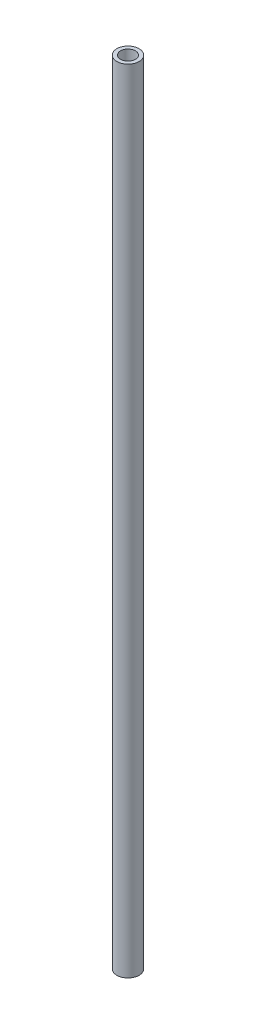
ISO-10303-21;
HEADER;
FILE_DESCRIPTION(('STEP AP214'),'2;1');
FILE_NAME('part.step','',(''),(''),'','','');
FILE_SCHEMA(('AUTOMOTIVE_DESIGN { 1 0 10303 214 1 1 1 1 }'));
ENDSEC;
DATA;
#1=APPLICATION_CONTEXT('core data for automotive mechanical design processes');
#2=APPLICATION_PROTOCOL_DEFINITION('international standard','automotive_design',2000,#1);
#3=PRODUCT_CONTEXT('',#1,'mechanical');
#4=PRODUCT('Part','Part','',(#3));
#5=PRODUCT_RELATED_PRODUCT_CATEGORY('part','',(#4));
#6=PRODUCT_DEFINITION_FORMATION('','',#4);
#7=PRODUCT_DEFINITION_CONTEXT('part definition',#1,'design');
#8=PRODUCT_DEFINITION('design','',#6,#7);
#9=PRODUCT_DEFINITION_SHAPE('','',#8);
#10=(LENGTH_UNIT() NAMED_UNIT(*) SI_UNIT(.MILLI.,.METRE.));
#11=(NAMED_UNIT(*) PLANE_ANGLE_UNIT() SI_UNIT($,.RADIAN.));
#12=(NAMED_UNIT(*) SI_UNIT($,.STERADIAN.) SOLID_ANGLE_UNIT());
#13=UNCERTAINTY_MEASURE_WITH_UNIT(LENGTH_MEASURE(1.E-05),#10,'distance_accuracy_value','');
#14=(GEOMETRIC_REPRESENTATION_CONTEXT(3) GLOBAL_UNCERTAINTY_ASSIGNED_CONTEXT((#13)) GLOBAL_UNIT_ASSIGNED_CONTEXT((#10,
#11,#12)) REPRESENTATION_CONTEXT('',''));
#15=CARTESIAN_POINT('',(0.,0.,0.));
#16=DIRECTION('',(0.,0.,1.));
#17=DIRECTION('',(1.,0.,0.));
#18=AXIS2_PLACEMENT_3D('',#15,#16,#17);
#19=CARTESIAN_POINT('',(0.,160.,0.));
#20=DIRECTION('',(0.,1.,0.));
#21=DIRECTION('',(0.,0.,1.));
#22=AXIS2_PLACEMENT_3D('',#19,#20,#21);
#23=PLANE('',#22);
#24=CARTESIAN_POINT('',(0.,160.,0.));
#25=DIRECTION('',(0.,1.,0.));
#26=DIRECTION('',(0.,0.,1.));
#27=AXIS2_PLACEMENT_3D('',#24,#25,#26);
#28=CIRCLE('',#27,2.25000000000009);
#29=CARTESIAN_POINT('',(0.,160.,2.25000000000009));
#30=VERTEX_POINT('',#29);
#31=EDGE_CURVE('E10',#30,#30,#28,.T.);
#32=ORIENTED_EDGE('',*,*,#31,.T.);
#33=EDGE_LOOP('',(#32));
#34=FACE_BOUND('',#33,.T.);
#35=CARTESIAN_POINT('',(0.,160.,0.));
#36=DIRECTION('',(0.,1.,0.));
#37=DIRECTION('',(0.,0.,1.));
#38=AXIS2_PLACEMENT_3D('',#35,#36,#37);
#39=CIRCLE('',#38,1.50000000000006);
#40=CARTESIAN_POINT('',(0.,160.,1.50000000000006));
#41=VERTEX_POINT('',#40);
#42=EDGE_CURVE('E50',#41,#41,#39,.T.);
#43=ORIENTED_EDGE('',*,*,#42,.F.);
#44=EDGE_LOOP('',(#43));
#45=FACE_BOUND('',#44,.T.);
#46=ADVANCED_FACE('F37',(#34,#45),#23,.T.);
#47=CARTESIAN_POINT('',(0.,0.,0.));
#48=DIRECTION('',(0.,1.,0.));
#49=DIRECTION('',(0.,0.,1.));
#50=AXIS2_PLACEMENT_3D('',#47,#48,#49);
#51=PLANE('',#50);
#52=CARTESIAN_POINT('',(0.,0.,0.));
#53=DIRECTION('',(0.,1.,0.));
#54=DIRECTION('',(0.,0.,1.));
#55=AXIS2_PLACEMENT_3D('',#52,#53,#54);
#56=CIRCLE('',#55,2.25000000000009);
#57=CARTESIAN_POINT('',(0.,0.,2.25000000000009));
#58=VERTEX_POINT('',#57);
#59=EDGE_CURVE('E41',#58,#58,#56,.T.);
#60=ORIENTED_EDGE('',*,*,#59,.F.);
#61=EDGE_LOOP('',(#60));
#62=FACE_BOUND('',#61,.T.);
#63=CARTESIAN_POINT('',(0.,0.,0.));
#64=DIRECTION('',(0.,1.,0.));
#65=DIRECTION('',(0.,0.,1.));
#66=AXIS2_PLACEMENT_3D('',#63,#64,#65);
#67=CIRCLE('',#66,1.50000000000006);
#68=CARTESIAN_POINT('',(0.,0.,1.50000000000006));
#69=VERTEX_POINT('',#68);
#70=EDGE_CURVE('E52',#69,#69,#67,.T.);
#71=ORIENTED_EDGE('',*,*,#70,.T.);
#72=EDGE_LOOP('',(#71));
#73=FACE_BOUND('',#72,.T.);
#74=ADVANCED_FACE('F64',(#62,#73),#51,.F.);
#75=CARTESIAN_POINT('',(0.,160.,0.));
#76=DIRECTION('',(0.,-1.,0.));
#77=DIRECTION('',(0.,0.,-1.));
#78=AXIS2_PLACEMENT_3D('',#75,#76,#77);
#79=CYLINDRICAL_SURFACE('',#78,2.25000000000009);
#80=ORIENTED_EDGE('',*,*,#31,.F.);
#81=EDGE_LOOP('',(#80));
#82=FACE_BOUND('',#81,.T.);
#83=ORIENTED_EDGE('',*,*,#59,.T.);
#84=EDGE_LOOP('',(#83));
#85=FACE_BOUND('',#84,.T.);
#86=ADVANCED_FACE('F39',(#82,#85),#79,.T.);
#87=CARTESIAN_POINT('',(0.,160.,0.));
#88=DIRECTION('',(0.,-1.,0.));
#89=DIRECTION('',(0.,0.,-1.));
#90=AXIS2_PLACEMENT_3D('',#87,#88,#89);
#91=CYLINDRICAL_SURFACE('',#90,1.50000000000006);
#92=ORIENTED_EDGE('',*,*,#42,.T.);
#93=EDGE_LOOP('',(#92));
#94=FACE_BOUND('',#93,.T.);
#95=ORIENTED_EDGE('',*,*,#70,.F.);
#96=EDGE_LOOP('',(#95));
#97=FACE_BOUND('',#96,.T.);
#98=ADVANCED_FACE('F60',(#94,#97),#91,.F.);
#99=CLOSED_SHELL('',(#46,#74,#86,#98));
#100=MANIFOLD_SOLID_BREP('B2',#99);
#101=ADVANCED_BREP_SHAPE_REPRESENTATION('',(#18,#100),#14);
#102=SHAPE_DEFINITION_REPRESENTATION(#9,#101);
ENDSEC;
END-ISO-10303-21;
